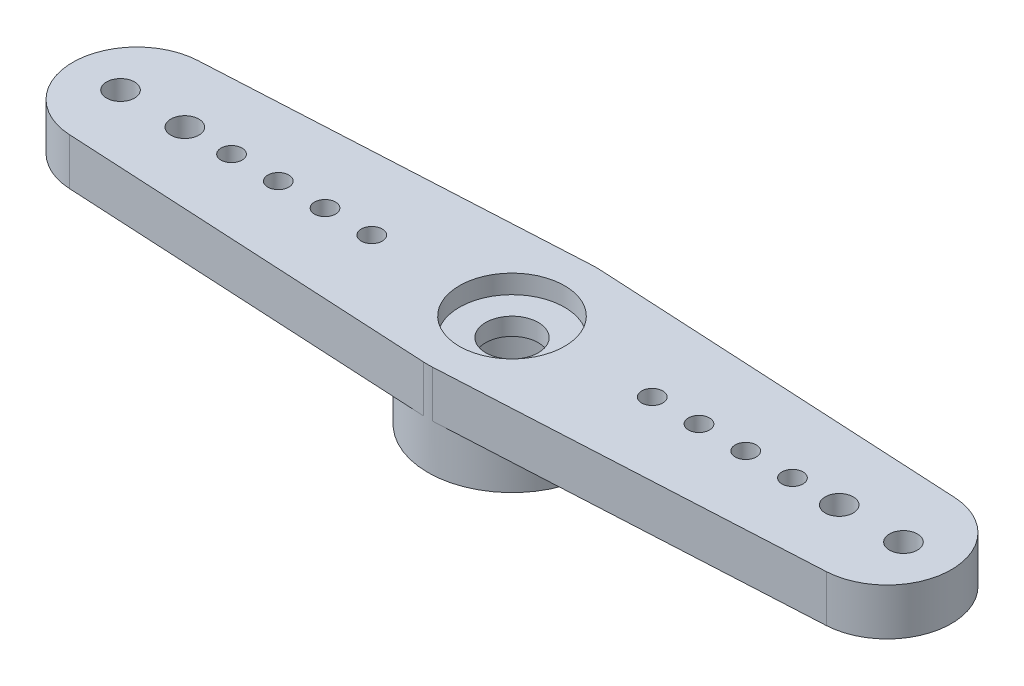
ISO-10303-21;
HEADER;
FILE_DESCRIPTION(('STEP AP214'),'2;1');
FILE_NAME('part.step','',(''),(''),'','','');
FILE_SCHEMA(('AUTOMOTIVE_DESIGN { 1 0 10303 214 1 1 1 1 }'));
ENDSEC;
DATA;
#1=APPLICATION_CONTEXT('core data for automotive mechanical design processes');
#2=APPLICATION_PROTOCOL_DEFINITION('international standard','automotive_design',2000,#1);
#3=PRODUCT_CONTEXT('',#1,'mechanical');
#4=PRODUCT('Part','Part','',(#3));
#5=PRODUCT_RELATED_PRODUCT_CATEGORY('part','',(#4));
#6=PRODUCT_DEFINITION_FORMATION('','',#4);
#7=PRODUCT_DEFINITION_CONTEXT('part definition',#1,'design');
#8=PRODUCT_DEFINITION('design','',#6,#7);
#9=PRODUCT_DEFINITION_SHAPE('','',#8);
#10=(LENGTH_UNIT() NAMED_UNIT(*) SI_UNIT(.MILLI.,.METRE.));
#11=(NAMED_UNIT(*) PLANE_ANGLE_UNIT() SI_UNIT($,.RADIAN.));
#12=(NAMED_UNIT(*) SI_UNIT($,.STERADIAN.) SOLID_ANGLE_UNIT());
#13=UNCERTAINTY_MEASURE_WITH_UNIT(LENGTH_MEASURE(1.E-05),#10,'distance_accuracy_value','');
#14=(GEOMETRIC_REPRESENTATION_CONTEXT(3) GLOBAL_UNCERTAINTY_ASSIGNED_CONTEXT((#13)) GLOBAL_UNIT_ASSIGNED_CONTEXT((#10,
#11,#12)) REPRESENTATION_CONTEXT('',''));
#15=CARTESIAN_POINT('',(0.,0.,0.));
#16=DIRECTION('',(0.,0.,1.));
#17=DIRECTION('',(1.,0.,0.));
#18=AXIS2_PLACEMENT_3D('',#15,#16,#17);
#19=CARTESIAN_POINT('',(0.,55.,0.));
#20=DIRECTION('',(0.,1.,0.));
#21=DIRECTION('',(0.,0.,1.));
#22=AXIS2_PLACEMENT_3D('',#19,#20,#21);
#23=CYLINDRICAL_SURFACE('',#22,3.6);
#24=CARTESIAN_POINT('',(0.,-2.,0.));
#25=DIRECTION('',(0.,1.,0.));
#26=DIRECTION('',(0.,0.,1.));
#27=AXIS2_PLACEMENT_3D('',#24,#25,#26);
#28=CIRCLE('',#27,3.6);
#29=CARTESIAN_POINT('',(0.,-2.,3.6));
#30=VERTEX_POINT('',#29);
#31=EDGE_CURVE('E120',#30,#30,#28,.T.);
#32=ORIENTED_EDGE('',*,*,#31,.T.);
#33=EDGE_LOOP('',(#32));
#34=FACE_BOUND('',#33,.T.);
#35=CARTESIAN_POINT('',(0.,0.,0.));
#36=DIRECTION('',(0.,1.,0.));
#37=DIRECTION('',(0.,0.,1.));
#38=AXIS2_PLACEMENT_3D('',#35,#36,#37);
#39=CIRCLE('',#38,3.6);
#40=CARTESIAN_POINT('',(0.190654205607477,0.,3.59494797930154));
#41=VERTEX_POINT('',#40);
#42=CARTESIAN_POINT('',(0.190654205607477,0.,-3.59494797930153));
#43=VERTEX_POINT('',#42);
#44=EDGE_CURVE('E11',#41,#43,#39,.T.);
#45=ORIENTED_EDGE('',*,*,#44,.F.);
#46=DIRECTION('',(0.,-1.,0.));
#47=VECTOR('',#46,1.);
#48=CARTESIAN_POINT('',(0.190654205607477,40.2831555648173,3.59494797930154));
#49=LINE('',#48,#47);
#50=CARTESIAN_POINT('',(0.190654205607477,2.,3.59494797930154));
#51=VERTEX_POINT('',#50);
#52=EDGE_CURVE('E162',#51,#41,#49,.T.);
#53=ORIENTED_EDGE('',*,*,#52,.F.);
#54=CARTESIAN_POINT('',(0.,2.,0.));
#55=DIRECTION('',(0.,1.,0.));
#56=DIRECTION('',(0.,0.,1.));
#57=AXIS2_PLACEMENT_3D('',#54,#55,#56);
#58=CIRCLE('',#57,3.6);
#59=CARTESIAN_POINT('',(-0.190654205607477,2.,3.59494797930153));
#60=VERTEX_POINT('',#59);
#61=EDGE_CURVE('E121',#60,#51,#58,.T.);
#62=ORIENTED_EDGE('',*,*,#61,.F.);
#63=DIRECTION('',(0.,-1.,0.));
#64=VECTOR('',#63,1.);
#65=CARTESIAN_POINT('',(-0.190654205607478,40.2831555648173,3.59494797930153));
#66=LINE('',#65,#64);
#67=CARTESIAN_POINT('',(-0.190654205607478,0.,3.59494797930153));
#68=VERTEX_POINT('',#67);
#69=EDGE_CURVE('E47',#60,#68,#66,.T.);
#70=ORIENTED_EDGE('',*,*,#69,.T.);
#71=CARTESIAN_POINT('',(-0.190654205607477,0.,-3.59494797930153));
#72=VERTEX_POINT('',#71);
#73=EDGE_CURVE('E40',#72,#68,#39,.T.);
#74=ORIENTED_EDGE('',*,*,#73,.F.);
#75=DIRECTION('',(0.,-1.,0.));
#76=VECTOR('',#75,1.);
#77=CARTESIAN_POINT('',(-0.190654205607477,40.2831555648173,-3.59494797930153));
#78=LINE('',#77,#76);
#79=CARTESIAN_POINT('',(-0.190654205607477,2.,-3.59494797930153));
#80=VERTEX_POINT('',#79);
#81=EDGE_CURVE('E103',#80,#72,#78,.T.);
#82=ORIENTED_EDGE('',*,*,#81,.F.);
#83=CARTESIAN_POINT('',(0.190654205607477,2.,-3.59494797930153));
#84=VERTEX_POINT('',#83);
#85=EDGE_CURVE('E114',#84,#80,#58,.T.);
#86=ORIENTED_EDGE('',*,*,#85,.F.);
#87=DIRECTION('',(0.,-1.,0.));
#88=VECTOR('',#87,1.);
#89=CARTESIAN_POINT('',(0.190654205607477,40.2831555648173,-3.59494797930153));
#90=LINE('',#89,#88);
#91=EDGE_CURVE('E55',#84,#43,#90,.T.);
#92=ORIENTED_EDGE('',*,*,#91,.T.);
#93=EDGE_LOOP('',(#45,#53,#62,#70,#74,#82,#86,#92));
#94=FACE_BOUND('',#93,.T.);
#95=ADVANCED_FACE('F32',(#34,#94),#23,.T.);
#96=CARTESIAN_POINT('',(3.6,2.,0.));
#97=DIRECTION('',(0.,-1.,0.));
#98=DIRECTION('',(0.,0.,-1.));
#99=AXIS2_PLACEMENT_3D('',#96,#97,#98);
#100=PLANE('',#99);
#101=CARTESIAN_POINT('',(0.,2.,0.));
#102=DIRECTION('',(0.,1.,0.));
#103=DIRECTION('',(0.,0.,1.));
#104=AXIS2_PLACEMENT_3D('',#101,#102,#103);
#105=CIRCLE('',#104,2.25);
#106=CARTESIAN_POINT('',(0.,2.,2.25));
#107=VERTEX_POINT('',#106);
#108=EDGE_CURVE('E144',#107,#107,#105,.T.);
#109=ORIENTED_EDGE('',*,*,#108,.F.);
#110=EDGE_LOOP('',(#109));
#111=FACE_BOUND('',#110,.T.);
#112=ORIENTED_EDGE('',*,*,#61,.T.);
#113=DIRECTION('',(-0.998596660917093,0.,0.0529595015576324));
#114=VECTOR('',#113,1.);
#115=CARTESIAN_POINT('',(0.190654205607477,2.,3.59494797930154));
#116=LINE('',#115,#114);
#117=CARTESIAN_POINT('',(16.1956386292835,2.,2.74614081752201));
#118=VERTEX_POINT('',#117);
#119=EDGE_CURVE('E160',#118,#51,#116,.T.);
#120=ORIENTED_EDGE('',*,*,#119,.F.);
#121=CARTESIAN_POINT('',(16.05,2.,0.));
#122=DIRECTION('',(0.,-1.,0.));
#123=DIRECTION('',(0.,0.,-1.));
#124=AXIS2_PLACEMENT_3D('',#121,#122,#123);
#125=CIRCLE('',#124,2.75);
#126=CARTESIAN_POINT('',(16.1956386292835,2.,-2.74614081752201));
#127=VERTEX_POINT('',#126);
#128=EDGE_CURVE('E172',#127,#118,#125,.T.);
#129=ORIENTED_EDGE('',*,*,#128,.F.);
#130=DIRECTION('',(0.998596660917093,0.,0.0529595015576324));
#131=VECTOR('',#130,1.);
#132=CARTESIAN_POINT('',(16.1956386292835,2.,-2.74614081752201));
#133=LINE('',#132,#131);
#134=EDGE_CURVE('E119',#84,#127,#133,.T.);
#135=ORIENTED_EDGE('',*,*,#134,.F.);
#136=ORIENTED_EDGE('',*,*,#85,.T.);
#137=DIRECTION('',(0.998596660917093,0.,-0.0529595015576324));
#138=VECTOR('',#137,1.);
#139=CARTESIAN_POINT('',(-0.190654205607477,2.,-3.59494797930153));
#140=LINE('',#139,#138);
#141=CARTESIAN_POINT('',(-16.1956386292835,2.,-2.74614081752201));
#142=VERTEX_POINT('',#141);
#143=EDGE_CURVE('E99',#142,#80,#140,.T.);
#144=ORIENTED_EDGE('',*,*,#143,.F.);
#145=CARTESIAN_POINT('',(-16.05,2.,0.));
#146=DIRECTION('',(0.,-1.,0.));
#147=DIRECTION('',(0.,0.,-1.));
#148=AXIS2_PLACEMENT_3D('',#145,#146,#147);
#149=CIRCLE('',#148,2.75);
#150=CARTESIAN_POINT('',(-16.1956386292835,2.,2.74614081752201));
#151=VERTEX_POINT('',#150);
#152=EDGE_CURVE('E178',#151,#142,#149,.T.);
#153=ORIENTED_EDGE('',*,*,#152,.F.);
#154=DIRECTION('',(-0.998596660917093,0.,-0.0529595015576324));
#155=VECTOR('',#154,1.);
#156=CARTESIAN_POINT('',(-16.1956386292835,2.,2.74614081752201));
#157=LINE('',#156,#155);
#158=EDGE_CURVE('E180',#60,#151,#157,.T.);
#159=ORIENTED_EDGE('',*,*,#158,.F.);
#160=EDGE_LOOP('',(#112,#120,#129,#135,#136,#144,#153,#159));
#161=FACE_BOUND('',#160,.T.);
#162=CARTESIAN_POINT('',(-16.75,2.,0.));
#163=DIRECTION('',(0.,-1.,0.));
#164=DIRECTION('',(0.,0.,-1.));
#165=AXIS2_PLACEMENT_3D('',#162,#163,#164);
#166=CIRCLE('',#165,0.6);
#167=CARTESIAN_POINT('',(-16.75,2.,-0.6));
#168=VERTEX_POINT('',#167);
#169=EDGE_CURVE('E126',#168,#168,#166,.T.);
#170=ORIENTED_EDGE('',*,*,#169,.T.);
#171=EDGE_LOOP('',(#170));
#172=FACE_BOUND('',#171,.T.);
#173=CARTESIAN_POINT('',(-14.,2.,0.));
#174=DIRECTION('',(0.,-1.,0.));
#175=DIRECTION('',(0.,0.,-1.));
#176=AXIS2_PLACEMENT_3D('',#173,#174,#175);
#177=CIRCLE('',#176,0.6);
#178=CARTESIAN_POINT('',(-14.,2.,-0.6));
#179=VERTEX_POINT('',#178);
#180=EDGE_CURVE('E188',#179,#179,#177,.T.);
#181=ORIENTED_EDGE('',*,*,#180,.T.);
#182=EDGE_LOOP('',(#181));
#183=FACE_BOUND('',#182,.T.);
#184=CARTESIAN_POINT('',(-12.,2.,0.));
#185=DIRECTION('',(0.,-1.,0.));
#186=DIRECTION('',(0.,0.,-1.));
#187=AXIS2_PLACEMENT_3D('',#184,#185,#186);
#188=CIRCLE('',#187,0.45);
#189=CARTESIAN_POINT('',(-12.,2.,-0.45));
#190=VERTEX_POINT('',#189);
#191=EDGE_CURVE('E194',#190,#190,#188,.T.);
#192=ORIENTED_EDGE('',*,*,#191,.T.);
#193=EDGE_LOOP('',(#192));
#194=FACE_BOUND('',#193,.T.);
#195=CARTESIAN_POINT('',(-10.,2.,0.));
#196=DIRECTION('',(0.,-1.,0.));
#197=DIRECTION('',(0.,0.,-1.));
#198=AXIS2_PLACEMENT_3D('',#195,#196,#197);
#199=CIRCLE('',#198,0.45);
#200=CARTESIAN_POINT('',(-10.,2.,-0.45));
#201=VERTEX_POINT('',#200);
#202=EDGE_CURVE('E197',#201,#201,#199,.T.);
#203=ORIENTED_EDGE('',*,*,#202,.T.);
#204=EDGE_LOOP('',(#203));
#205=FACE_BOUND('',#204,.T.);
#206=CARTESIAN_POINT('',(-8.,2.,0.));
#207=DIRECTION('',(0.,-1.,0.));
#208=DIRECTION('',(0.,0.,-1.));
#209=AXIS2_PLACEMENT_3D('',#206,#207,#208);
#210=CIRCLE('',#209,0.45);
#211=CARTESIAN_POINT('',(-8.,2.,-0.45));
#212=VERTEX_POINT('',#211);
#213=EDGE_CURVE('E200',#212,#212,#210,.T.);
#214=ORIENTED_EDGE('',*,*,#213,.T.);
#215=EDGE_LOOP('',(#214));
#216=FACE_BOUND('',#215,.T.);
#217=CARTESIAN_POINT('',(-6.,2.,0.));
#218=DIRECTION('',(0.,-1.,0.));
#219=DIRECTION('',(0.,0.,-1.));
#220=AXIS2_PLACEMENT_3D('',#217,#218,#219);
#221=CIRCLE('',#220,0.45);
#222=CARTESIAN_POINT('',(-6.,2.,-0.45));
#223=VERTEX_POINT('',#222);
#224=EDGE_CURVE('E203',#223,#223,#221,.T.);
#225=ORIENTED_EDGE('',*,*,#224,.T.);
#226=EDGE_LOOP('',(#225));
#227=FACE_BOUND('',#226,.T.);
#228=CARTESIAN_POINT('',(16.75,2.,0.));
#229=DIRECTION('',(0.,-1.,0.));
#230=DIRECTION('',(0.,0.,-1.));
#231=AXIS2_PLACEMENT_3D('',#228,#229,#230);
#232=CIRCLE('',#231,0.6);
#233=CARTESIAN_POINT('',(16.75,2.,-0.6));
#234=VERTEX_POINT('',#233);
#235=EDGE_CURVE('E185',#234,#234,#232,.T.);
#236=ORIENTED_EDGE('',*,*,#235,.T.);
#237=EDGE_LOOP('',(#236));
#238=FACE_BOUND('',#237,.T.);
#239=CARTESIAN_POINT('',(14.,2.,0.));
#240=DIRECTION('',(0.,-1.,0.));
#241=DIRECTION('',(0.,0.,-1.));
#242=AXIS2_PLACEMENT_3D('',#239,#240,#241);
#243=CIRCLE('',#242,0.6);
#244=CARTESIAN_POINT('',(14.,2.,-0.6));
#245=VERTEX_POINT('',#244);
#246=EDGE_CURVE('E191',#245,#245,#243,.T.);
#247=ORIENTED_EDGE('',*,*,#246,.T.);
#248=EDGE_LOOP('',(#247));
#249=FACE_BOUND('',#248,.T.);
#250=CARTESIAN_POINT('',(6.,2.,0.));
#251=DIRECTION('',(0.,-1.,0.));
#252=DIRECTION('',(0.,0.,-1.));
#253=AXIS2_PLACEMENT_3D('',#250,#251,#252);
#254=CIRCLE('',#253,0.45);
#255=CARTESIAN_POINT('',(6.,2.,-0.45));
#256=VERTEX_POINT('',#255);
#257=EDGE_CURVE('E206',#256,#256,#254,.T.);
#258=ORIENTED_EDGE('',*,*,#257,.T.);
#259=EDGE_LOOP('',(#258));
#260=FACE_BOUND('',#259,.T.);
#261=CARTESIAN_POINT('',(8.,2.,0.));
#262=DIRECTION('',(0.,-1.,0.));
#263=DIRECTION('',(0.,0.,-1.));
#264=AXIS2_PLACEMENT_3D('',#261,#262,#263);
#265=CIRCLE('',#264,0.45);
#266=CARTESIAN_POINT('',(8.,2.,-0.45));
#267=VERTEX_POINT('',#266);
#268=EDGE_CURVE('E209',#267,#267,#265,.T.);
#269=ORIENTED_EDGE('',*,*,#268,.T.);
#270=EDGE_LOOP('',(#269));
#271=FACE_BOUND('',#270,.T.);
#272=CARTESIAN_POINT('',(10.,2.,0.));
#273=DIRECTION('',(0.,-1.,0.));
#274=DIRECTION('',(0.,0.,-1.));
#275=AXIS2_PLACEMENT_3D('',#272,#273,#274);
#276=CIRCLE('',#275,0.45);
#277=CARTESIAN_POINT('',(10.,2.,-0.45));
#278=VERTEX_POINT('',#277);
#279=EDGE_CURVE('E211',#278,#278,#276,.T.);
#280=ORIENTED_EDGE('',*,*,#279,.T.);
#281=EDGE_LOOP('',(#280));
#282=FACE_BOUND('',#281,.T.);
#283=CARTESIAN_POINT('',(12.,2.,0.));
#284=DIRECTION('',(0.,-1.,0.));
#285=DIRECTION('',(0.,0.,-1.));
#286=AXIS2_PLACEMENT_3D('',#283,#284,#285);
#287=CIRCLE('',#286,0.45);
#288=CARTESIAN_POINT('',(12.,2.,-0.45));
#289=VERTEX_POINT('',#288);
#290=EDGE_CURVE('E128',#289,#289,#287,.T.);
#291=ORIENTED_EDGE('',*,*,#290,.T.);
#292=EDGE_LOOP('',(#291));
#293=FACE_BOUND('',#292,.T.);
#294=ADVANCED_FACE('F34',(#111,#161,#172,#183,#194,#205,#216,#227,#238,#249,#260,#271,#282,
#293),#100,.F.);
#295=CARTESIAN_POINT('',(0.,55.,0.));
#296=DIRECTION('',(0.,1.,0.));
#297=DIRECTION('',(0.,0.,1.));
#298=AXIS2_PLACEMENT_3D('',#295,#296,#297);
#299=CYLINDRICAL_SURFACE('',#298,2.25);
#300=CARTESIAN_POINT('',(0.,1.2,0.));
#301=DIRECTION('',(0.,1.,0.));
#302=DIRECTION('',(0.,0.,1.));
#303=AXIS2_PLACEMENT_3D('',#300,#301,#302);
#304=CIRCLE('',#303,2.25);
#305=CARTESIAN_POINT('',(0.,1.2,2.25));
#306=VERTEX_POINT('',#305);
#307=EDGE_CURVE('E142',#306,#306,#304,.T.);
#308=ORIENTED_EDGE('',*,*,#307,.F.);
#309=EDGE_LOOP('',(#308));
#310=FACE_BOUND('',#309,.T.);
#311=ORIENTED_EDGE('',*,*,#108,.T.);
#312=EDGE_LOOP('',(#311));
#313=FACE_BOUND('',#312,.T.);
#314=ADVANCED_FACE('F293',(#310,#313),#299,.F.);
#315=CARTESIAN_POINT('',(2.25,1.2,0.));
#316=DIRECTION('',(0.,-1.,0.));
#317=DIRECTION('',(0.,0.,-1.));
#318=AXIS2_PLACEMENT_3D('',#315,#316,#317);
#319=PLANE('',#318);
#320=CARTESIAN_POINT('',(0.,1.2,0.));
#321=DIRECTION('',(0.,1.,0.));
#322=DIRECTION('',(0.,0.,1.));
#323=AXIS2_PLACEMENT_3D('',#320,#321,#322);
#324=CIRCLE('',#323,1.125);
#325=CARTESIAN_POINT('',(0.,1.2,1.125));
#326=VERTEX_POINT('',#325);
#327=EDGE_CURVE('E139',#326,#326,#324,.T.);
#328=ORIENTED_EDGE('',*,*,#327,.F.);
#329=EDGE_LOOP('',(#328));
#330=FACE_BOUND('',#329,.T.);
#331=ORIENTED_EDGE('',*,*,#307,.T.);
#332=EDGE_LOOP('',(#331));
#333=FACE_BOUND('',#332,.T.);
#334=ADVANCED_FACE('F314',(#330,#333),#319,.F.);
#335=CARTESIAN_POINT('',(0.,55.,0.));
#336=DIRECTION('',(0.,1.,0.));
#337=DIRECTION('',(0.,0.,1.));
#338=AXIS2_PLACEMENT_3D('',#335,#336,#337);
#339=CYLINDRICAL_SURFACE('',#338,1.125);
#340=CARTESIAN_POINT('',(0.,0.449999999999999,0.));
#341=DIRECTION('',(0.,1.,0.));
#342=DIRECTION('',(0.,0.,1.));
#343=AXIS2_PLACEMENT_3D('',#340,#341,#342);
#344=CIRCLE('',#343,1.125);
#345=CARTESIAN_POINT('',(0.,0.449999999999999,1.125));
#346=VERTEX_POINT('',#345);
#347=EDGE_CURVE('E136',#346,#346,#344,.T.);
#348=ORIENTED_EDGE('',*,*,#347,.F.);
#349=EDGE_LOOP('',(#348));
#350=FACE_BOUND('',#349,.T.);
#351=ORIENTED_EDGE('',*,*,#327,.T.);
#352=EDGE_LOOP('',(#351));
#353=FACE_BOUND('',#352,.T.);
#354=ADVANCED_FACE('F310',(#350,#353),#339,.F.);
#355=CARTESIAN_POINT('',(1.125,0.45,0.));
#356=DIRECTION('',(0.,1.,0.));
#357=DIRECTION('',(0.,0.,1.));
#358=AXIS2_PLACEMENT_3D('',#355,#356,#357);
#359=PLANE('',#358);
#360=CARTESIAN_POINT('',(0.,0.449999999999999,0.));
#361=DIRECTION('',(0.,1.,0.));
#362=DIRECTION('',(0.,0.,1.));
#363=AXIS2_PLACEMENT_3D('',#360,#361,#362);
#364=CIRCLE('',#363,2.425);
#365=CARTESIAN_POINT('',(0.,0.449999999999999,2.425));
#366=VERTEX_POINT('',#365);
#367=EDGE_CURVE('E133',#366,#366,#364,.T.);
#368=ORIENTED_EDGE('',*,*,#367,.F.);
#369=EDGE_LOOP('',(#368));
#370=FACE_BOUND('',#369,.T.);
#371=ORIENTED_EDGE('',*,*,#347,.T.);
#372=EDGE_LOOP('',(#371));
#373=FACE_BOUND('',#372,.T.);
#374=ADVANCED_FACE('F306',(#370,#373),#359,.F.);
#375=CARTESIAN_POINT('',(0.,55.,0.));
#376=DIRECTION('',(0.,1.,0.));
#377=DIRECTION('',(0.,0.,1.));
#378=AXIS2_PLACEMENT_3D('',#375,#376,#377);
#379=CYLINDRICAL_SURFACE('',#378,2.425);
#380=ORIENTED_EDGE('',*,*,#367,.T.);
#381=EDGE_LOOP('',(#380));
#382=FACE_BOUND('',#381,.T.);
#383=CARTESIAN_POINT('',(0.,-2.,0.));
#384=DIRECTION('',(0.,1.,0.));
#385=DIRECTION('',(0.,0.,1.));
#386=AXIS2_PLACEMENT_3D('',#383,#384,#385);
#387=CIRCLE('',#386,2.425);
#388=CARTESIAN_POINT('',(0.,-2.,2.425));
#389=VERTEX_POINT('',#388);
#390=EDGE_CURVE('E124',#389,#389,#387,.T.);
#391=ORIENTED_EDGE('',*,*,#390,.F.);
#392=EDGE_LOOP('',(#391));
#393=FACE_BOUND('',#392,.T.);
#394=ADVANCED_FACE('F302',(#382,#393),#379,.F.);
#395=CARTESIAN_POINT('',(2.425,-2.,0.));
#396=DIRECTION('',(0.,1.,0.));
#397=DIRECTION('',(0.,0.,1.));
#398=AXIS2_PLACEMENT_3D('',#395,#396,#397);
#399=PLANE('',#398);
#400=ORIENTED_EDGE('',*,*,#31,.F.);
#401=EDGE_LOOP('',(#400));
#402=FACE_BOUND('',#401,.T.);
#403=ORIENTED_EDGE('',*,*,#390,.T.);
#404=EDGE_LOOP('',(#403));
#405=FACE_BOUND('',#404,.T.);
#406=ADVANCED_FACE('F299',(#402,#405),#399,.F.);
#407=CARTESIAN_POINT('',(-16.05,40.2831555648173,0.));
#408=DIRECTION('',(0.,-1.,0.));
#409=DIRECTION('',(0.,0.,-1.));
#410=AXIS2_PLACEMENT_3D('',#407,#408,#409);
#411=CYLINDRICAL_SURFACE('',#410,2.75);
#412=DIRECTION('',(0.,-1.,0.));
#413=VECTOR('',#412,1.);
#414=CARTESIAN_POINT('',(-16.1956386292835,40.2831555648173,2.74614081752201));
#415=LINE('',#414,#413);
#416=CARTESIAN_POINT('',(-16.1956386292835,0.,2.74614081752201));
#417=VERTEX_POINT('',#416);
#418=EDGE_CURVE('E155',#151,#417,#415,.T.);
#419=ORIENTED_EDGE('',*,*,#418,.F.);
#420=ORIENTED_EDGE('',*,*,#152,.T.);
#421=DIRECTION('',(0.,-1.,0.));
#422=VECTOR('',#421,1.);
#423=CARTESIAN_POINT('',(-16.1956386292835,40.2831555648173,-2.74614081752201));
#424=LINE('',#423,#422);
#425=CARTESIAN_POINT('',(-16.1956386292835,0.,-2.74614081752201));
#426=VERTEX_POINT('',#425);
#427=EDGE_CURVE('E105',#142,#426,#424,.T.);
#428=ORIENTED_EDGE('',*,*,#427,.T.);
#429=CARTESIAN_POINT('',(-16.05,0.,0.));
#430=DIRECTION('',(0.,1.,0.));
#431=DIRECTION('',(0.,0.,1.));
#432=AXIS2_PLACEMENT_3D('',#429,#430,#431);
#433=CIRCLE('',#432,2.75);
#434=EDGE_CURVE('E181',#426,#417,#433,.T.);
#435=ORIENTED_EDGE('',*,*,#434,.T.);
#436=EDGE_LOOP('',(#419,#420,#428,#435));
#437=FACE_BOUND('',#436,.T.);
#438=ADVANCED_FACE('F268',(#437),#411,.T.);
#439=CARTESIAN_POINT('',(-6.,40.2831555648173,0.));
#440=DIRECTION('',(0.,-1.,0.));
#441=DIRECTION('',(0.,0.,-1.));
#442=AXIS2_PLACEMENT_3D('',#439,#440,#441);
#443=CYLINDRICAL_SURFACE('',#442,0.45);
#444=ORIENTED_EDGE('',*,*,#224,.F.);
#445=EDGE_LOOP('',(#444));
#446=FACE_BOUND('',#445,.T.);
#447=CARTESIAN_POINT('',(-6.,0.,0.));
#448=DIRECTION('',(0.,1.,0.));
#449=DIRECTION('',(0.,0.,1.));
#450=AXIS2_PLACEMENT_3D('',#447,#448,#449);
#451=CIRCLE('',#450,0.45);
#452=CARTESIAN_POINT('',(-6.,0.,0.45));
#453=VERTEX_POINT('',#452);
#454=EDGE_CURVE('E250',#453,#453,#451,.T.);
#455=ORIENTED_EDGE('',*,*,#454,.F.);
#456=EDGE_LOOP('',(#455));
#457=FACE_BOUND('',#456,.T.);
#458=ADVANCED_FACE('F352',(#446,#457),#443,.F.);
#459=CARTESIAN_POINT('',(-8.,40.2831555648173,0.));
#460=DIRECTION('',(0.,-1.,0.));
#461=DIRECTION('',(0.,0.,-1.));
#462=AXIS2_PLACEMENT_3D('',#459,#460,#461);
#463=CYLINDRICAL_SURFACE('',#462,0.45);
#464=ORIENTED_EDGE('',*,*,#213,.F.);
#465=EDGE_LOOP('',(#464));
#466=FACE_BOUND('',#465,.T.);
#467=CARTESIAN_POINT('',(-8.,0.,0.));
#468=DIRECTION('',(0.,1.,0.));
#469=DIRECTION('',(0.,0.,1.));
#470=AXIS2_PLACEMENT_3D('',#467,#468,#469);
#471=CIRCLE('',#470,0.45);
#472=CARTESIAN_POINT('',(-8.,0.,0.45));
#473=VERTEX_POINT('',#472);
#474=EDGE_CURVE('E247',#473,#473,#471,.T.);
#475=ORIENTED_EDGE('',*,*,#474,.F.);
#476=EDGE_LOOP('',(#475));
#477=FACE_BOUND('',#476,.T.);
#478=ADVANCED_FACE('F359',(#466,#477),#463,.F.);
#479=CARTESIAN_POINT('',(-10.,40.2831555648173,0.));
#480=DIRECTION('',(0.,-1.,0.));
#481=DIRECTION('',(0.,0.,-1.));
#482=AXIS2_PLACEMENT_3D('',#479,#480,#481);
#483=CYLINDRICAL_SURFACE('',#482,0.45);
#484=ORIENTED_EDGE('',*,*,#202,.F.);
#485=EDGE_LOOP('',(#484));
#486=FACE_BOUND('',#485,.T.);
#487=CARTESIAN_POINT('',(-10.,0.,0.));
#488=DIRECTION('',(0.,1.,0.));
#489=DIRECTION('',(0.,0.,1.));
#490=AXIS2_PLACEMENT_3D('',#487,#488,#489);
#491=CIRCLE('',#490,0.45);
#492=CARTESIAN_POINT('',(-10.,0.,0.45));
#493=VERTEX_POINT('',#492);
#494=EDGE_CURVE('E244',#493,#493,#491,.T.);
#495=ORIENTED_EDGE('',*,*,#494,.F.);
#496=EDGE_LOOP('',(#495));
#497=FACE_BOUND('',#496,.T.);
#498=ADVANCED_FACE('F367',(#486,#497),#483,.F.);
#499=CARTESIAN_POINT('',(-12.,40.2831555648173,0.));
#500=DIRECTION('',(0.,-1.,0.));
#501=DIRECTION('',(0.,0.,-1.));
#502=AXIS2_PLACEMENT_3D('',#499,#500,#501);
#503=CYLINDRICAL_SURFACE('',#502,0.45);
#504=ORIENTED_EDGE('',*,*,#191,.F.);
#505=EDGE_LOOP('',(#504));
#506=FACE_BOUND('',#505,.T.);
#507=CARTESIAN_POINT('',(-12.,0.,0.));
#508=DIRECTION('',(0.,1.,0.));
#509=DIRECTION('',(0.,0.,1.));
#510=AXIS2_PLACEMENT_3D('',#507,#508,#509);
#511=CIRCLE('',#510,0.45);
#512=CARTESIAN_POINT('',(-12.,0.,0.45));
#513=VERTEX_POINT('',#512);
#514=EDGE_CURVE('E241',#513,#513,#511,.T.);
#515=ORIENTED_EDGE('',*,*,#514,.F.);
#516=EDGE_LOOP('',(#515));
#517=FACE_BOUND('',#516,.T.);
#518=ADVANCED_FACE('F375',(#506,#517),#503,.F.);
#519=CARTESIAN_POINT('',(-14.,40.2831555648173,0.));
#520=DIRECTION('',(0.,-1.,0.));
#521=DIRECTION('',(0.,0.,-1.));
#522=AXIS2_PLACEMENT_3D('',#519,#520,#521);
#523=CYLINDRICAL_SURFACE('',#522,0.6);
#524=ORIENTED_EDGE('',*,*,#180,.F.);
#525=EDGE_LOOP('',(#524));
#526=FACE_BOUND('',#525,.T.);
#527=CARTESIAN_POINT('',(-14.,0.,0.));
#528=DIRECTION('',(0.,1.,0.));
#529=DIRECTION('',(0.,0.,1.));
#530=AXIS2_PLACEMENT_3D('',#527,#528,#529);
#531=CIRCLE('',#530,0.6);
#532=CARTESIAN_POINT('',(-14.,0.,0.6));
#533=VERTEX_POINT('',#532);
#534=EDGE_CURVE('E234',#533,#533,#531,.T.);
#535=ORIENTED_EDGE('',*,*,#534,.F.);
#536=EDGE_LOOP('',(#535));
#537=FACE_BOUND('',#536,.T.);
#538=ADVANCED_FACE('F383',(#526,#537),#523,.F.);
#539=CARTESIAN_POINT('',(-16.75,40.2831555648173,0.));
#540=DIRECTION('',(0.,-1.,0.));
#541=DIRECTION('',(0.,0.,-1.));
#542=AXIS2_PLACEMENT_3D('',#539,#540,#541);
#543=CYLINDRICAL_SURFACE('',#542,0.6);
#544=ORIENTED_EDGE('',*,*,#169,.F.);
#545=EDGE_LOOP('',(#544));
#546=FACE_BOUND('',#545,.T.);
#547=CARTESIAN_POINT('',(-16.75,0.,0.));
#548=DIRECTION('',(0.,1.,0.));
#549=DIRECTION('',(0.,0.,1.));
#550=AXIS2_PLACEMENT_3D('',#547,#548,#549);
#551=CIRCLE('',#550,0.6);
#552=CARTESIAN_POINT('',(-16.75,0.,0.6));
#553=VERTEX_POINT('',#552);
#554=EDGE_CURVE('E231',#553,#553,#551,.T.);
#555=ORIENTED_EDGE('',*,*,#554,.F.);
#556=EDGE_LOOP('',(#555));
#557=FACE_BOUND('',#556,.T.);
#558=ADVANCED_FACE('F391',(#546,#557),#543,.F.);
#559=CARTESIAN_POINT('',(-16.1956386292835,40.2831555648173,2.74614081752201));
#560=DIRECTION('',(0.0529595015576324,0.,-0.998596660917093));
#561=DIRECTION('',(-0.998596660917093,0.,-0.0529595015576324));
#562=AXIS2_PLACEMENT_3D('',#559,#560,#561);
#563=PLANE('',#562);
#564=ORIENTED_EDGE('',*,*,#69,.F.);
#565=ORIENTED_EDGE('',*,*,#158,.T.);
#566=ORIENTED_EDGE('',*,*,#418,.T.);
#567=DIRECTION('',(0.998596660917093,0.,0.0529595015576324));
#568=VECTOR('',#567,1.);
#569=CARTESIAN_POINT('',(-16.1956386292835,0.,2.74614081752201));
#570=LINE('',#569,#568);
#571=EDGE_CURVE('E152',#417,#68,#570,.T.);
#572=ORIENTED_EDGE('',*,*,#571,.T.);
#573=EDGE_LOOP('',(#564,#565,#566,#572));
#574=FACE_BOUND('',#573,.T.);
#575=ADVANCED_FACE('F153',(#574),#563,.F.);
#576=CARTESIAN_POINT('',(-0.190654205607477,40.2831555648173,-3.59494797930153));
#577=DIRECTION('',(0.0529595015576324,0.,0.998596660917093));
#578=DIRECTION('',(0.998596660917093,0.,-0.0529595015576324));
#579=AXIS2_PLACEMENT_3D('',#576,#577,#578);
#580=PLANE('',#579);
#581=ORIENTED_EDGE('',*,*,#427,.F.);
#582=ORIENTED_EDGE('',*,*,#143,.T.);
#583=ORIENTED_EDGE('',*,*,#81,.T.);
#584=DIRECTION('',(-0.998596660917093,0.,0.0529595015576324));
#585=VECTOR('',#584,1.);
#586=CARTESIAN_POINT('',(-0.190654205607477,0.,-3.59494797930153));
#587=LINE('',#586,#585);
#588=EDGE_CURVE('E115',#72,#426,#587,.T.);
#589=ORIENTED_EDGE('',*,*,#588,.T.);
#590=EDGE_LOOP('',(#581,#582,#583,#589));
#591=FACE_BOUND('',#590,.T.);
#592=ADVANCED_FACE('F101',(#591),#580,.F.);
#593=CARTESIAN_POINT('',(16.05,0.,0.));
#594=DIRECTION('',(0.,1.,0.));
#595=DIRECTION('',(0.,0.,1.));
#596=AXIS2_PLACEMENT_3D('',#593,#594,#595);
#597=PLANE('',#596);
#598=ORIENTED_EDGE('',*,*,#474,.T.);
#599=EDGE_LOOP('',(#598));
#600=FACE_BOUND('',#599,.T.);
#601=ORIENTED_EDGE('',*,*,#514,.T.);
#602=EDGE_LOOP('',(#601));
#603=FACE_BOUND('',#602,.T.);
#604=ORIENTED_EDGE('',*,*,#534,.T.);
#605=EDGE_LOOP('',(#604));
#606=FACE_BOUND('',#605,.T.);
#607=ORIENTED_EDGE('',*,*,#554,.T.);
#608=EDGE_LOOP('',(#607));
#609=FACE_BOUND('',#608,.T.);
#610=ORIENTED_EDGE('',*,*,#494,.T.);
#611=EDGE_LOOP('',(#610));
#612=FACE_BOUND('',#611,.T.);
#613=ORIENTED_EDGE('',*,*,#454,.T.);
#614=EDGE_LOOP('',(#613));
#615=FACE_BOUND('',#614,.T.);
#616=ORIENTED_EDGE('',*,*,#588,.F.);
#617=ORIENTED_EDGE('',*,*,#73,.T.);
#618=ORIENTED_EDGE('',*,*,#571,.F.);
#619=ORIENTED_EDGE('',*,*,#434,.F.);
#620=EDGE_LOOP('',(#616,#617,#618,#619));
#621=FACE_BOUND('',#620,.T.);
#622=ADVANCED_FACE('F150',(#600,#603,#606,#609,#612,#615,#621),#597,.F.);
#623=CARTESIAN_POINT('',(10.,0.,0.));
#624=DIRECTION('',(0.,1.,0.));
#625=DIRECTION('',(0.,0.,1.));
#626=AXIS2_PLACEMENT_3D('',#623,#624,#625);
#627=CIRCLE('',#626,0.45);
#628=CARTESIAN_POINT('',(10.,0.,0.45));
#629=VERTEX_POINT('',#628);
#630=EDGE_CURVE('E175',#629,#629,#627,.T.);
#631=ORIENTED_EDGE('',*,*,#630,.T.);
#632=EDGE_LOOP('',(#631));
#633=FACE_BOUND('',#632,.T.);
#634=CARTESIAN_POINT('',(6.,0.,0.));
#635=DIRECTION('',(0.,1.,0.));
#636=DIRECTION('',(0.,0.,1.));
#637=AXIS2_PLACEMENT_3D('',#634,#635,#636);
#638=CIRCLE('',#637,0.45);
#639=CARTESIAN_POINT('',(6.,0.,0.45));
#640=VERTEX_POINT('',#639);
#641=EDGE_CURVE('E253',#640,#640,#638,.T.);
#642=ORIENTED_EDGE('',*,*,#641,.T.);
#643=EDGE_LOOP('',(#642));
#644=FACE_BOUND('',#643,.T.);
#645=CARTESIAN_POINT('',(16.75,0.,0.));
#646=DIRECTION('',(0.,1.,0.));
#647=DIRECTION('',(0.,0.,1.));
#648=AXIS2_PLACEMENT_3D('',#645,#646,#647);
#649=CIRCLE('',#648,0.6);
#650=CARTESIAN_POINT('',(16.75,0.,0.6));
#651=VERTEX_POINT('',#650);
#652=EDGE_CURVE('E235',#651,#651,#649,.T.);
#653=ORIENTED_EDGE('',*,*,#652,.T.);
#654=EDGE_LOOP('',(#653));
#655=FACE_BOUND('',#654,.T.);
#656=CARTESIAN_POINT('',(14.,0.,0.));
#657=DIRECTION('',(0.,1.,0.));
#658=DIRECTION('',(0.,0.,1.));
#659=AXIS2_PLACEMENT_3D('',#656,#657,#658);
#660=CIRCLE('',#659,0.6);
#661=CARTESIAN_POINT('',(14.,0.,0.6));
#662=VERTEX_POINT('',#661);
#663=EDGE_CURVE('E238',#662,#662,#660,.T.);
#664=ORIENTED_EDGE('',*,*,#663,.T.);
#665=EDGE_LOOP('',(#664));
#666=FACE_BOUND('',#665,.T.);
#667=CARTESIAN_POINT('',(8.,0.,0.));
#668=DIRECTION('',(0.,1.,0.));
#669=DIRECTION('',(0.,0.,1.));
#670=AXIS2_PLACEMENT_3D('',#667,#668,#669);
#671=CIRCLE('',#670,0.45);
#672=CARTESIAN_POINT('',(8.,0.,0.45));
#673=VERTEX_POINT('',#672);
#674=EDGE_CURVE('E256',#673,#673,#671,.T.);
#675=ORIENTED_EDGE('',*,*,#674,.T.);
#676=EDGE_LOOP('',(#675));
#677=FACE_BOUND('',#676,.T.);
#678=CARTESIAN_POINT('',(12.,0.,0.));
#679=DIRECTION('',(0.,1.,0.));
#680=DIRECTION('',(0.,0.,1.));
#681=AXIS2_PLACEMENT_3D('',#678,#679,#680);
#682=CIRCLE('',#681,0.45);
#683=CARTESIAN_POINT('',(12.,0.,0.45));
#684=VERTEX_POINT('',#683);
#685=EDGE_CURVE('E261',#684,#684,#682,.T.);
#686=ORIENTED_EDGE('',*,*,#685,.T.);
#687=EDGE_LOOP('',(#686));
#688=FACE_BOUND('',#687,.T.);
#689=DIRECTION('',(0.998596660917093,0.,-0.0529595015576324));
#690=VECTOR('',#689,1.);
#691=CARTESIAN_POINT('',(0.190654205607477,0.,3.59494797930154));
#692=LINE('',#691,#690);
#693=CARTESIAN_POINT('',(16.1956386292835,0.,2.74614081752201));
#694=VERTEX_POINT('',#693);
#695=EDGE_CURVE('E168',#41,#694,#692,.T.);
#696=ORIENTED_EDGE('',*,*,#695,.F.);
#697=ORIENTED_EDGE('',*,*,#44,.T.);
#698=DIRECTION('',(-0.998596660917093,0.,-0.0529595015576324));
#699=VECTOR('',#698,1.);
#700=CARTESIAN_POINT('',(16.1956386292835,0.,-2.74614081752201));
#701=LINE('',#700,#699);
#702=CARTESIAN_POINT('',(16.1956386292835,0.,-2.74614081752201));
#703=VERTEX_POINT('',#702);
#704=EDGE_CURVE('E227',#703,#43,#701,.T.);
#705=ORIENTED_EDGE('',*,*,#704,.F.);
#706=CARTESIAN_POINT('',(16.05,0.,0.));
#707=DIRECTION('',(0.,1.,0.));
#708=DIRECTION('',(0.,0.,1.));
#709=AXIS2_PLACEMENT_3D('',#706,#707,#708);
#710=CIRCLE('',#709,2.75);
#711=EDGE_CURVE('E171',#694,#703,#710,.T.);
#712=ORIENTED_EDGE('',*,*,#711,.F.);
#713=EDGE_LOOP('',(#696,#697,#705,#712));
#714=FACE_BOUND('',#713,.T.);
#715=ADVANCED_FACE('F416',(#633,#644,#655,#666,#677,#688,#714),#597,.F.);
#716=CARTESIAN_POINT('',(16.05,40.2831555648173,0.));
#717=DIRECTION('',(0.,-1.,0.));
#718=DIRECTION('',(0.,0.,-1.));
#719=AXIS2_PLACEMENT_3D('',#716,#717,#718);
#720=CYLINDRICAL_SURFACE('',#719,2.75);
#721=DIRECTION('',(0.,-1.,0.));
#722=VECTOR('',#721,1.);
#723=CARTESIAN_POINT('',(16.1956386292835,40.2831555648173,-2.74614081752201));
#724=LINE('',#723,#722);
#725=EDGE_CURVE('E176',#127,#703,#724,.T.);
#726=ORIENTED_EDGE('',*,*,#725,.F.);
#727=ORIENTED_EDGE('',*,*,#128,.T.);
#728=DIRECTION('',(0.,-1.,0.));
#729=VECTOR('',#728,1.);
#730=CARTESIAN_POINT('',(16.1956386292835,40.2831555648173,2.74614081752201));
#731=LINE('',#730,#729);
#732=EDGE_CURVE('E169',#118,#694,#731,.T.);
#733=ORIENTED_EDGE('',*,*,#732,.T.);
#734=ORIENTED_EDGE('',*,*,#711,.T.);
#735=EDGE_LOOP('',(#726,#727,#733,#734));
#736=FACE_BOUND('',#735,.T.);
#737=ADVANCED_FACE('F271',(#736),#720,.T.);
#738=CARTESIAN_POINT('',(16.1956386292835,40.2831555648173,-2.74614081752201));
#739=DIRECTION('',(-0.0529595015576324,0.,0.998596660917093));
#740=DIRECTION('',(0.998596660917093,0.,0.0529595015576324));
#741=AXIS2_PLACEMENT_3D('',#738,#739,#740);
#742=PLANE('',#741);
#743=ORIENTED_EDGE('',*,*,#91,.F.);
#744=ORIENTED_EDGE('',*,*,#134,.T.);
#745=ORIENTED_EDGE('',*,*,#725,.T.);
#746=ORIENTED_EDGE('',*,*,#704,.T.);
#747=EDGE_LOOP('',(#743,#744,#745,#746));
#748=FACE_BOUND('',#747,.T.);
#749=ADVANCED_FACE('F275',(#748),#742,.F.);
#750=CARTESIAN_POINT('',(0.190654205607477,40.2831555648173,3.59494797930154));
#751=DIRECTION('',(-0.0529595015576324,0.,-0.998596660917093));
#752=DIRECTION('',(-0.998596660917093,0.,0.0529595015576324));
#753=AXIS2_PLACEMENT_3D('',#750,#751,#752);
#754=PLANE('',#753);
#755=ORIENTED_EDGE('',*,*,#732,.F.);
#756=ORIENTED_EDGE('',*,*,#119,.T.);
#757=ORIENTED_EDGE('',*,*,#52,.T.);
#758=ORIENTED_EDGE('',*,*,#695,.T.);
#759=EDGE_LOOP('',(#755,#756,#757,#758));
#760=FACE_BOUND('',#759,.T.);
#761=ADVANCED_FACE('F272',(#760),#754,.F.);
#762=CARTESIAN_POINT('',(16.75,40.2831555648173,0.));
#763=DIRECTION('',(0.,-1.,0.));
#764=DIRECTION('',(0.,0.,-1.));
#765=AXIS2_PLACEMENT_3D('',#762,#763,#764);
#766=CYLINDRICAL_SURFACE('',#765,0.6);
#767=ORIENTED_EDGE('',*,*,#235,.F.);
#768=EDGE_LOOP('',(#767));
#769=FACE_BOUND('',#768,.T.);
#770=ORIENTED_EDGE('',*,*,#652,.F.);
#771=EDGE_LOOP('',(#770));
#772=FACE_BOUND('',#771,.T.);
#773=ADVANCED_FACE('F274',(#769,#772),#766,.F.);
#774=CARTESIAN_POINT('',(14.,40.2831555648173,0.));
#775=DIRECTION('',(0.,-1.,0.));
#776=DIRECTION('',(0.,0.,-1.));
#777=AXIS2_PLACEMENT_3D('',#774,#775,#776);
#778=CYLINDRICAL_SURFACE('',#777,0.6);
#779=ORIENTED_EDGE('',*,*,#246,.F.);
#780=EDGE_LOOP('',(#779));
#781=FACE_BOUND('',#780,.T.);
#782=ORIENTED_EDGE('',*,*,#663,.F.);
#783=EDGE_LOOP('',(#782));
#784=FACE_BOUND('',#783,.T.);
#785=ADVANCED_FACE('F281',(#781,#784),#778,.F.);
#786=CARTESIAN_POINT('',(6.,40.2831555648173,0.));
#787=DIRECTION('',(0.,-1.,0.));
#788=DIRECTION('',(0.,0.,-1.));
#789=AXIS2_PLACEMENT_3D('',#786,#787,#788);
#790=CYLINDRICAL_SURFACE('',#789,0.45);
#791=ORIENTED_EDGE('',*,*,#257,.F.);
#792=EDGE_LOOP('',(#791));
#793=FACE_BOUND('',#792,.T.);
#794=ORIENTED_EDGE('',*,*,#641,.F.);
#795=EDGE_LOOP('',(#794));
#796=FACE_BOUND('',#795,.T.);
#797=ADVANCED_FACE('F453',(#793,#796),#790,.F.);
#798=CARTESIAN_POINT('',(8.,40.2831555648173,0.));
#799=DIRECTION('',(0.,-1.,0.));
#800=DIRECTION('',(0.,0.,-1.));
#801=AXIS2_PLACEMENT_3D('',#798,#799,#800);
#802=CYLINDRICAL_SURFACE('',#801,0.45);
#803=ORIENTED_EDGE('',*,*,#268,.F.);
#804=EDGE_LOOP('',(#803));
#805=FACE_BOUND('',#804,.T.);
#806=ORIENTED_EDGE('',*,*,#674,.F.);
#807=EDGE_LOOP('',(#806));
#808=FACE_BOUND('',#807,.T.);
#809=ADVANCED_FACE('F463',(#805,#808),#802,.F.);
#810=CARTESIAN_POINT('',(10.,40.2831555648173,0.));
#811=DIRECTION('',(0.,-1.,0.));
#812=DIRECTION('',(0.,0.,-1.));
#813=AXIS2_PLACEMENT_3D('',#810,#811,#812);
#814=CYLINDRICAL_SURFACE('',#813,0.45);
#815=ORIENTED_EDGE('',*,*,#279,.F.);
#816=EDGE_LOOP('',(#815));
#817=FACE_BOUND('',#816,.T.);
#818=ORIENTED_EDGE('',*,*,#630,.F.);
#819=EDGE_LOOP('',(#818));
#820=FACE_BOUND('',#819,.T.);
#821=ADVANCED_FACE('F473',(#817,#820),#814,.F.);
#822=CARTESIAN_POINT('',(12.,40.2831555648173,0.));
#823=DIRECTION('',(0.,-1.,0.));
#824=DIRECTION('',(0.,0.,-1.));
#825=AXIS2_PLACEMENT_3D('',#822,#823,#824);
#826=CYLINDRICAL_SURFACE('',#825,0.45);
#827=ORIENTED_EDGE('',*,*,#290,.F.);
#828=EDGE_LOOP('',(#827));
#829=FACE_BOUND('',#828,.T.);
#830=ORIENTED_EDGE('',*,*,#685,.F.);
#831=EDGE_LOOP('',(#830));
#832=FACE_BOUND('',#831,.T.);
#833=ADVANCED_FACE('F297',(#829,#832),#826,.F.);
#834=CLOSED_SHELL('',(#95,#294,#314,#334,#354,#374,#394,#406,#438,#458,#478,#498,#518,#538,#558,
#575,#592,#622,#715,#737,#749,#761,#773,#785,#797,#809,#821,#833));
#835=MANIFOLD_SOLID_BREP('B2',#834);
#836=ADVANCED_BREP_SHAPE_REPRESENTATION('',(#18,#835),#14);
#837=SHAPE_DEFINITION_REPRESENTATION(#9,#836);
ENDSEC;
END-ISO-10303-21;
